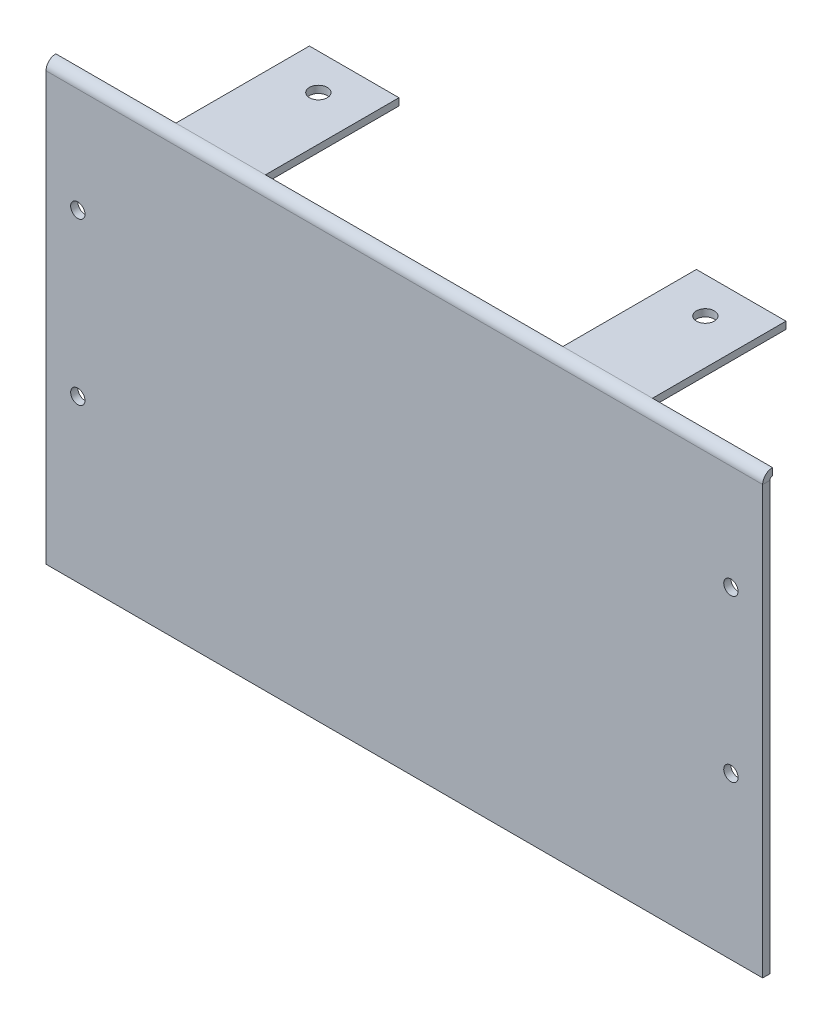
ISO-10303-21;
HEADER;
FILE_DESCRIPTION(('STEP AP214'),'2;1');
FILE_NAME('part.step','',(''),(''),'','','');
FILE_SCHEMA(('AUTOMOTIVE_DESIGN { 1 0 10303 214 1 1 1 1 }'));
ENDSEC;
DATA;
#1=APPLICATION_CONTEXT('core data for automotive mechanical design processes');
#2=APPLICATION_PROTOCOL_DEFINITION('international standard','automotive_design',2000,#1);
#3=PRODUCT_CONTEXT('',#1,'mechanical');
#4=PRODUCT('Part','Part','',(#3));
#5=PRODUCT_RELATED_PRODUCT_CATEGORY('part','',(#4));
#6=PRODUCT_DEFINITION_FORMATION('','',#4);
#7=PRODUCT_DEFINITION_CONTEXT('part definition',#1,'design');
#8=PRODUCT_DEFINITION('design','',#6,#7);
#9=PRODUCT_DEFINITION_SHAPE('','',#8);
#10=(LENGTH_UNIT() NAMED_UNIT(*) SI_UNIT(.MILLI.,.METRE.));
#11=(NAMED_UNIT(*) PLANE_ANGLE_UNIT() SI_UNIT($,.RADIAN.));
#12=(NAMED_UNIT(*) SI_UNIT($,.STERADIAN.) SOLID_ANGLE_UNIT());
#13=UNCERTAINTY_MEASURE_WITH_UNIT(LENGTH_MEASURE(1.E-05),#10,'distance_accuracy_value','');
#14=(GEOMETRIC_REPRESENTATION_CONTEXT(3) GLOBAL_UNCERTAINTY_ASSIGNED_CONTEXT((#13)) GLOBAL_UNIT_ASSIGNED_CONTEXT((#10,
#11,#12)) REPRESENTATION_CONTEXT('',''));
#15=CARTESIAN_POINT('',(0.,0.,0.));
#16=DIRECTION('',(0.,0.,1.));
#17=DIRECTION('',(1.,0.,0.));
#18=AXIS2_PLACEMENT_3D('',#15,#16,#17);
#19=CARTESIAN_POINT('',(0.,122.,4.45228893450774E-13));
#20=DIRECTION('',(0.,1.,0.));
#21=DIRECTION('',(0.,0.,1.));
#22=AXIS2_PLACEMENT_3D('',#19,#20,#21);
#23=PLANE('',#22);
#24=DIRECTION('',(0.,0.,-1.));
#25=VECTOR('',#24,1.);
#26=CARTESIAN_POINT('',(141.5,122.,-2.7366));
#27=LINE('',#26,#25);
#28=CARTESIAN_POINT('',(141.5,122.,-2.7366));
#29=VERTEX_POINT('',#28);
#30=CARTESIAN_POINT('',(141.5,122.,-40.));
#31=VERTEX_POINT('',#30);
#32=EDGE_CURVE('E279',#29,#31,#27,.T.);
#33=ORIENTED_EDGE('',*,*,#32,.F.);
#34=DIRECTION('',(1.,0.,0.));
#35=VECTOR('',#34,1.);
#36=CARTESIAN_POINT('',(0.,122.,-2.7366));
#37=LINE('',#36,#35);
#38=CARTESIAN_POINT('',(166.5,122.,-2.73659999999999));
#39=VERTEX_POINT('',#38);
#40=EDGE_CURVE('E244',#29,#39,#37,.T.);
#41=ORIENTED_EDGE('',*,*,#40,.T.);
#42=DIRECTION('',(0.,0.,1.));
#43=VECTOR('',#42,1.);
#44=CARTESIAN_POINT('',(166.5,122.,-2.73659999999999));
#45=LINE('',#44,#43);
#46=CARTESIAN_POINT('',(166.5,122.,-40.));
#47=VERTEX_POINT('',#46);
#48=EDGE_CURVE('E295',#47,#39,#45,.T.);
#49=ORIENTED_EDGE('',*,*,#48,.F.);
#50=DIRECTION('',(1.,0.,0.));
#51=VECTOR('',#50,1.);
#52=CARTESIAN_POINT('',(200.,122.,-40.));
#53=LINE('',#52,#51);
#54=EDGE_CURVE('E153',#31,#47,#53,.T.);
#55=ORIENTED_EDGE('',*,*,#54,.F.);
#56=EDGE_LOOP('',(#33,#41,#49,#55));
#57=FACE_BOUND('',#56,.T.);
#58=CARTESIAN_POINT('',(154.,122.,-30.));
#59=DIRECTION('',(0.,1.,0.));
#60=DIRECTION('',(0.,0.,1.));
#61=AXIS2_PLACEMENT_3D('',#58,#59,#60);
#62=CIRCLE('',#61,2.5);
#63=CARTESIAN_POINT('',(154.,122.,-27.5));
#64=VERTEX_POINT('',#63);
#65=EDGE_CURVE('E312',#64,#64,#62,.T.);
#66=ORIENTED_EDGE('',*,*,#65,.F.);
#67=EDGE_LOOP('',(#66));
#68=FACE_BOUND('',#67,.T.);
#69=ADVANCED_FACE('F37',(#57,#68),#23,.T.);
#70=CARTESIAN_POINT('',(0.,120.,4.38245930773088E-13));
#71=DIRECTION('',(0.,1.,0.));
#72=DIRECTION('',(0.,0.,1.));
#73=AXIS2_PLACEMENT_3D('',#70,#71,#72);
#74=PLANE('',#73);
#75=CARTESIAN_POINT('',(154.,120.,-30.));
#76=DIRECTION('',(0.,1.,0.));
#77=DIRECTION('',(0.,0.,1.));
#78=AXIS2_PLACEMENT_3D('',#75,#76,#77);
#79=CIRCLE('',#78,2.5);
#80=CARTESIAN_POINT('',(154.,120.,-27.5));
#81=VERTEX_POINT('',#80);
#82=EDGE_CURVE('E253',#81,#81,#79,.F.);
#83=ORIENTED_EDGE('',*,*,#82,.F.);
#84=EDGE_LOOP('',(#83));
#85=FACE_BOUND('',#84,.T.);
#86=DIRECTION('',(1.,0.,0.));
#87=VECTOR('',#86,1.);
#88=CARTESIAN_POINT('',(0.,120.,-2.73660000000001));
#89=LINE('',#88,#87);
#90=CARTESIAN_POINT('',(141.5,120.,-2.73660000000001));
#91=VERTEX_POINT('',#90);
#92=CARTESIAN_POINT('',(166.5,120.,-2.7366));
#93=VERTEX_POINT('',#92);
#94=EDGE_CURVE('E249',#91,#93,#89,.T.);
#95=ORIENTED_EDGE('',*,*,#94,.F.);
#96=DIRECTION('',(0.,0.,1.));
#97=VECTOR('',#96,1.);
#98=CARTESIAN_POINT('',(141.5,120.,-2.73660000000001));
#99=LINE('',#98,#97);
#100=CARTESIAN_POINT('',(141.5,120.,-40.));
#101=VERTEX_POINT('',#100);
#102=EDGE_CURVE('E328',#101,#91,#99,.T.);
#103=ORIENTED_EDGE('',*,*,#102,.F.);
#104=DIRECTION('',(1.,0.,0.));
#105=VECTOR('',#104,1.);
#106=CARTESIAN_POINT('',(200.,120.,-40.));
#107=LINE('',#106,#105);
#108=CARTESIAN_POINT('',(166.5,120.,-40.));
#109=VERTEX_POINT('',#108);
#110=EDGE_CURVE('E154',#101,#109,#107,.T.);
#111=ORIENTED_EDGE('',*,*,#110,.T.);
#112=DIRECTION('',(0.,0.,-1.));
#113=VECTOR('',#112,1.);
#114=CARTESIAN_POINT('',(166.5,120.,-2.7366));
#115=LINE('',#114,#113);
#116=EDGE_CURVE('E292',#93,#109,#115,.T.);
#117=ORIENTED_EDGE('',*,*,#116,.F.);
#118=EDGE_LOOP('',(#95,#103,#111,#117));
#119=FACE_BOUND('',#118,.T.);
#120=ADVANCED_FACE('F319',(#85,#119),#74,.F.);
#121=CARTESIAN_POINT('',(200.,122.,-40.));
#122=DIRECTION('',(0.,0.,-1.));
#123=DIRECTION('',(0.,1.,0.));
#124=AXIS2_PLACEMENT_3D('',#121,#122,#123);
#125=PLANE('',#124);
#126=DIRECTION('',(0.,1.,0.));
#127=VECTOR('',#126,1.);
#128=CARTESIAN_POINT('',(141.5,-0.000999999999987122,-40.0000000000004));
#129=LINE('',#128,#127);
#130=EDGE_CURVE('E282',#101,#31,#129,.T.);
#131=ORIENTED_EDGE('',*,*,#130,.T.);
#132=ORIENTED_EDGE('',*,*,#54,.T.);
#133=DIRECTION('',(0.,1.,0.));
#134=VECTOR('',#133,1.);
#135=CARTESIAN_POINT('',(166.5,-0.000999999999987122,-40.0000000000004));
#136=LINE('',#135,#134);
#137=EDGE_CURVE('E300',#109,#47,#136,.T.);
#138=ORIENTED_EDGE('',*,*,#137,.F.);
#139=ORIENTED_EDGE('',*,*,#110,.F.);
#140=EDGE_LOOP('',(#131,#132,#138,#139));
#141=FACE_BOUND('',#140,.T.);
#142=ADVANCED_FACE('F322',(#141),#125,.T.);
#143=CARTESIAN_POINT('',(200.,0.,-2.));
#144=DIRECTION('',(1.,0.,0.));
#145=DIRECTION('',(0.,0.,-1.));
#146=AXIS2_PLACEMENT_3D('',#143,#144,#145);
#147=PLANE('',#146);
#148=DIRECTION('',(0.,1.,0.));
#149=VECTOR('',#148,1.);
#150=CARTESIAN_POINT('',(200.,0.,-2.));
#151=LINE('',#150,#149);
#152=CARTESIAN_POINT('',(200.,0.,-2.));
#153=VERTEX_POINT('',#152);
#154=CARTESIAN_POINT('',(200.,119.2634,-2.));
#155=VERTEX_POINT('',#154);
#156=EDGE_CURVE('E214',#153,#155,#151,.T.);
#157=ORIENTED_EDGE('',*,*,#156,.T.);
#158=DIRECTION('',(0.,0.,1.));
#159=VECTOR('',#158,1.);
#160=CARTESIAN_POINT('',(200.,119.2634,-2.));
#161=LINE('',#160,#159);
#162=CARTESIAN_POINT('',(200.,119.2634,0.));
#163=VERTEX_POINT('',#162);
#164=EDGE_CURVE('E167',#155,#163,#161,.T.);
#165=ORIENTED_EDGE('',*,*,#164,.T.);
#166=DIRECTION('',(0.,1.,0.));
#167=VECTOR('',#166,1.);
#168=CARTESIAN_POINT('',(200.,0.,0.));
#169=LINE('',#168,#167);
#170=CARTESIAN_POINT('',(200.,0.,0.));
#171=VERTEX_POINT('',#170);
#172=EDGE_CURVE('E211',#171,#163,#169,.T.);
#173=ORIENTED_EDGE('',*,*,#172,.F.);
#174=DIRECTION('',(0.,0.,1.));
#175=VECTOR('',#174,1.);
#176=CARTESIAN_POINT('',(200.,0.,-2.));
#177=LINE('',#176,#175);
#178=EDGE_CURVE('E11',#153,#171,#177,.T.);
#179=ORIENTED_EDGE('',*,*,#178,.F.);
#180=EDGE_LOOP('',(#157,#165,#173,#179));
#181=FACE_BOUND('',#180,.T.);
#182=ADVANCED_FACE('F405',(#181),#147,.T.);
#183=CARTESIAN_POINT('',(0.,0.,-2.));
#184=DIRECTION('',(0.,0.,-1.));
#185=DIRECTION('',(-1.,0.,0.));
#186=AXIS2_PLACEMENT_3D('',#183,#184,#185);
#187=PLANE('',#186);
#188=CARTESIAN_POINT('',(8.86999999999999,90.,-2.));
#189=DIRECTION('',(0.,0.,-1.));
#190=DIRECTION('',(-1.,0.,0.));
#191=AXIS2_PLACEMENT_3D('',#188,#189,#190);
#192=CIRCLE('',#191,2.);
#193=CARTESIAN_POINT('',(6.86999999999999,90.,-2.));
#194=VERTEX_POINT('',#193);
#195=EDGE_CURVE('E199',#194,#194,#192,.F.);
#196=ORIENTED_EDGE('',*,*,#195,.T.);
#197=EDGE_LOOP('',(#196));
#198=FACE_BOUND('',#197,.T.);
#199=CARTESIAN_POINT('',(8.86999999999999,45.,-2.));
#200=DIRECTION('',(0.,0.,-1.));
#201=DIRECTION('',(-1.,0.,0.));
#202=AXIS2_PLACEMENT_3D('',#199,#200,#201);
#203=CIRCLE('',#202,2.);
#204=CARTESIAN_POINT('',(6.86999999999999,45.,-2.));
#205=VERTEX_POINT('',#204);
#206=EDGE_CURVE('E193',#205,#205,#203,.F.);
#207=ORIENTED_EDGE('',*,*,#206,.T.);
#208=EDGE_LOOP('',(#207));
#209=FACE_BOUND('',#208,.T.);
#210=CARTESIAN_POINT('',(191.13,45.,-2.));
#211=DIRECTION('',(0.,0.,-1.));
#212=DIRECTION('',(-1.,0.,0.));
#213=AXIS2_PLACEMENT_3D('',#210,#211,#212);
#214=CIRCLE('',#213,2.);
#215=CARTESIAN_POINT('',(189.13,45.,-2.));
#216=VERTEX_POINT('',#215);
#217=EDGE_CURVE('E187',#216,#216,#214,.F.);
#218=ORIENTED_EDGE('',*,*,#217,.T.);
#219=EDGE_LOOP('',(#218));
#220=FACE_BOUND('',#219,.T.);
#221=CARTESIAN_POINT('',(191.13,90.,-2.));
#222=DIRECTION('',(0.,0.,-1.));
#223=DIRECTION('',(-1.,0.,0.));
#224=AXIS2_PLACEMENT_3D('',#221,#222,#223);
#225=CIRCLE('',#224,2.);
#226=CARTESIAN_POINT('',(189.13,90.,-2.));
#227=VERTEX_POINT('',#226);
#228=EDGE_CURVE('E182',#227,#227,#225,.F.);
#229=ORIENTED_EDGE('',*,*,#228,.T.);
#230=EDGE_LOOP('',(#229));
#231=FACE_BOUND('',#230,.T.);
#232=DIRECTION('',(0.,-1.,0.));
#233=VECTOR('',#232,1.);
#234=CARTESIAN_POINT('',(0.,0.,-2.));
#235=LINE('',#234,#233);
#236=CARTESIAN_POINT('',(0.,119.2634,-2.));
#237=VERTEX_POINT('',#236);
#238=CARTESIAN_POINT('',(0.,0.,-2.));
#239=VERTEX_POINT('',#238);
#240=EDGE_CURVE('E208',#237,#239,#235,.T.);
#241=ORIENTED_EDGE('',*,*,#240,.F.);
#242=DIRECTION('',(1.,0.,0.));
#243=VECTOR('',#242,1.);
#244=CARTESIAN_POINT('',(200.,119.2634,-2.));
#245=LINE('',#244,#243);
#246=EDGE_CURVE('E173',#155,#237,#245,.F.);
#247=ORIENTED_EDGE('',*,*,#246,.F.);
#248=ORIENTED_EDGE('',*,*,#156,.F.);
#249=DIRECTION('',(1.,0.,0.));
#250=VECTOR('',#249,1.);
#251=CARTESIAN_POINT('',(0.,0.,-2.));
#252=LINE('',#251,#250);
#253=EDGE_CURVE('E210',#239,#153,#252,.T.);
#254=ORIENTED_EDGE('',*,*,#253,.F.);
#255=EDGE_LOOP('',(#241,#247,#248,#254));
#256=FACE_BOUND('',#255,.T.);
#257=ADVANCED_FACE('F402',(#198,#209,#220,#231,#256),#187,.T.);
#258=CARTESIAN_POINT('',(0.,0.,0.));
#259=DIRECTION('',(0.,0.,-1.));
#260=DIRECTION('',(-1.,0.,0.));
#261=AXIS2_PLACEMENT_3D('',#258,#259,#260);
#262=PLANE('',#261);
#263=CARTESIAN_POINT('',(8.86999999999999,90.,0.));
#264=DIRECTION('',(0.,0.,1.));
#265=DIRECTION('',(1.,0.,0.));
#266=AXIS2_PLACEMENT_3D('',#263,#264,#265);
#267=CIRCLE('',#266,2.);
#268=CARTESIAN_POINT('',(10.87,90.,0.));
#269=VERTEX_POINT('',#268);
#270=EDGE_CURVE('E202',#269,#269,#267,.T.);
#271=ORIENTED_EDGE('',*,*,#270,.F.);
#272=EDGE_LOOP('',(#271));
#273=FACE_BOUND('',#272,.T.);
#274=CARTESIAN_POINT('',(8.86999999999999,45.,0.));
#275=DIRECTION('',(0.,0.,1.));
#276=DIRECTION('',(1.,0.,0.));
#277=AXIS2_PLACEMENT_3D('',#274,#275,#276);
#278=CIRCLE('',#277,2.);
#279=CARTESIAN_POINT('',(10.87,45.,0.));
#280=VERTEX_POINT('',#279);
#281=EDGE_CURVE('E196',#280,#280,#278,.T.);
#282=ORIENTED_EDGE('',*,*,#281,.F.);
#283=EDGE_LOOP('',(#282));
#284=FACE_BOUND('',#283,.T.);
#285=CARTESIAN_POINT('',(191.13,45.,0.));
#286=DIRECTION('',(0.,0.,1.));
#287=DIRECTION('',(1.,0.,0.));
#288=AXIS2_PLACEMENT_3D('',#285,#286,#287);
#289=CIRCLE('',#288,2.);
#290=CARTESIAN_POINT('',(193.13,45.,0.));
#291=VERTEX_POINT('',#290);
#292=EDGE_CURVE('E190',#291,#291,#289,.T.);
#293=ORIENTED_EDGE('',*,*,#292,.F.);
#294=EDGE_LOOP('',(#293));
#295=FACE_BOUND('',#294,.T.);
#296=CARTESIAN_POINT('',(191.13,90.,0.));
#297=DIRECTION('',(0.,0.,1.));
#298=DIRECTION('',(1.,0.,0.));
#299=AXIS2_PLACEMENT_3D('',#296,#297,#298);
#300=CIRCLE('',#299,2.);
#301=CARTESIAN_POINT('',(193.13,90.,0.));
#302=VERTEX_POINT('',#301);
#303=EDGE_CURVE('E184',#302,#302,#300,.T.);
#304=ORIENTED_EDGE('',*,*,#303,.F.);
#305=EDGE_LOOP('',(#304));
#306=FACE_BOUND('',#305,.T.);
#307=DIRECTION('',(1.,0.,0.));
#308=VECTOR('',#307,1.);
#309=CARTESIAN_POINT('',(200.,119.2634,0.));
#310=LINE('',#309,#308);
#311=CARTESIAN_POINT('',(0.,119.2634,0.));
#312=VERTEX_POINT('',#311);
#313=EDGE_CURVE('E161',#163,#312,#310,.F.);
#314=ORIENTED_EDGE('',*,*,#313,.T.);
#315=DIRECTION('',(0.,-1.,0.));
#316=VECTOR('',#315,1.);
#317=CARTESIAN_POINT('',(0.,0.,0.));
#318=LINE('',#317,#316);
#319=CARTESIAN_POINT('',(0.,0.,0.));
#320=VERTEX_POINT('',#319);
#321=EDGE_CURVE('E205',#312,#320,#318,.T.);
#322=ORIENTED_EDGE('',*,*,#321,.T.);
#323=DIRECTION('',(1.,0.,0.));
#324=VECTOR('',#323,1.);
#325=CARTESIAN_POINT('',(0.,0.,0.));
#326=LINE('',#325,#324);
#327=EDGE_CURVE('E218',#320,#171,#326,.T.);
#328=ORIENTED_EDGE('',*,*,#327,.T.);
#329=ORIENTED_EDGE('',*,*,#172,.T.);
#330=EDGE_LOOP('',(#314,#322,#328,#329));
#331=FACE_BOUND('',#330,.T.);
#332=ADVANCED_FACE('F225',(#273,#284,#295,#306,#331),#262,.F.);
#333=CARTESIAN_POINT('',(0.,0.,-2.));
#334=DIRECTION('',(-1.,0.,0.));
#335=DIRECTION('',(0.,0.,1.));
#336=AXIS2_PLACEMENT_3D('',#333,#334,#335);
#337=PLANE('',#336);
#338=DIRECTION('',(0.,0.,1.));
#339=VECTOR('',#338,1.);
#340=CARTESIAN_POINT('',(0.,119.2634,-2.));
#341=LINE('',#340,#339);
#342=EDGE_CURVE('E179',#237,#312,#341,.T.);
#343=ORIENTED_EDGE('',*,*,#342,.F.);
#344=ORIENTED_EDGE('',*,*,#240,.T.);
#345=DIRECTION('',(0.,0.,1.));
#346=VECTOR('',#345,1.);
#347=CARTESIAN_POINT('',(0.,0.,-2.));
#348=LINE('',#347,#346);
#349=EDGE_CURVE('E41',#239,#320,#348,.T.);
#350=ORIENTED_EDGE('',*,*,#349,.T.);
#351=ORIENTED_EDGE('',*,*,#321,.F.);
#352=EDGE_LOOP('',(#343,#344,#350,#351));
#353=FACE_BOUND('',#352,.T.);
#354=ADVANCED_FACE('F39',(#353),#337,.T.);
#355=CARTESIAN_POINT('',(0.,0.,-2.));
#356=DIRECTION('',(0.,-1.,0.));
#357=DIRECTION('',(0.,0.,-1.));
#358=AXIS2_PLACEMENT_3D('',#355,#356,#357);
#359=PLANE('',#358);
#360=ORIENTED_EDGE('',*,*,#327,.F.);
#361=ORIENTED_EDGE('',*,*,#349,.F.);
#362=ORIENTED_EDGE('',*,*,#253,.T.);
#363=ORIENTED_EDGE('',*,*,#178,.T.);
#364=EDGE_LOOP('',(#360,#361,#362,#363));
#365=FACE_BOUND('',#364,.T.);
#366=ADVANCED_FACE('F400',(#365),#359,.T.);
#367=CARTESIAN_POINT('',(8.86999999999999,90.,-2.001));
#368=DIRECTION('',(0.,0.,1.));
#369=DIRECTION('',(1.,0.,0.));
#370=AXIS2_PLACEMENT_3D('',#367,#368,#369);
#371=CYLINDRICAL_SURFACE('',#370,2.);
#372=ORIENTED_EDGE('',*,*,#195,.F.);
#373=EDGE_LOOP('',(#372));
#374=FACE_BOUND('',#373,.T.);
#375=ORIENTED_EDGE('',*,*,#270,.T.);
#376=EDGE_LOOP('',(#375));
#377=FACE_BOUND('',#376,.T.);
#378=ADVANCED_FACE('F396',(#374,#377),#371,.F.);
#379=CARTESIAN_POINT('',(8.86999999999999,45.,-2.001));
#380=DIRECTION('',(0.,0.,1.));
#381=DIRECTION('',(1.,0.,0.));
#382=AXIS2_PLACEMENT_3D('',#379,#380,#381);
#383=CYLINDRICAL_SURFACE('',#382,2.);
#384=ORIENTED_EDGE('',*,*,#206,.F.);
#385=EDGE_LOOP('',(#384));
#386=FACE_BOUND('',#385,.T.);
#387=ORIENTED_EDGE('',*,*,#281,.T.);
#388=EDGE_LOOP('',(#387));
#389=FACE_BOUND('',#388,.T.);
#390=ADVANCED_FACE('F392',(#386,#389),#383,.F.);
#391=CARTESIAN_POINT('',(191.13,45.,-2.001));
#392=DIRECTION('',(0.,0.,1.));
#393=DIRECTION('',(1.,0.,0.));
#394=AXIS2_PLACEMENT_3D('',#391,#392,#393);
#395=CYLINDRICAL_SURFACE('',#394,2.);
#396=ORIENTED_EDGE('',*,*,#217,.F.);
#397=EDGE_LOOP('',(#396));
#398=FACE_BOUND('',#397,.T.);
#399=ORIENTED_EDGE('',*,*,#292,.T.);
#400=EDGE_LOOP('',(#399));
#401=FACE_BOUND('',#400,.T.);
#402=ADVANCED_FACE('F388',(#398,#401),#395,.F.);
#403=CARTESIAN_POINT('',(191.13,90.,-2.001));
#404=DIRECTION('',(0.,0.,1.));
#405=DIRECTION('',(1.,0.,0.));
#406=AXIS2_PLACEMENT_3D('',#403,#404,#405);
#407=CYLINDRICAL_SURFACE('',#406,2.);
#408=ORIENTED_EDGE('',*,*,#228,.F.);
#409=EDGE_LOOP('',(#408));
#410=FACE_BOUND('',#409,.T.);
#411=ORIENTED_EDGE('',*,*,#303,.T.);
#412=EDGE_LOOP('',(#411));
#413=FACE_BOUND('',#412,.T.);
#414=ADVANCED_FACE('F383',(#410,#413),#407,.F.);
#415=CARTESIAN_POINT('',(0.,119.2634,-2.73660000000001));
#416=DIRECTION('',(-1.,0.,0.));
#417=DIRECTION('',(0.,0.,1.));
#418=AXIS2_PLACEMENT_3D('',#415,#416,#417);
#419=PLANE('',#418);
#420=DIRECTION('',(0.,1.,0.));
#421=VECTOR('',#420,1.);
#422=CARTESIAN_POINT('',(0.,120.,-2.73660000000001));
#423=LINE('',#422,#421);
#424=CARTESIAN_POINT('',(0.,120.,-2.73660000000001));
#425=VERTEX_POINT('',#424);
#426=CARTESIAN_POINT('',(0.,122.,-2.7366));
#427=VERTEX_POINT('',#426);
#428=EDGE_CURVE('E252',#425,#427,#423,.T.);
#429=ORIENTED_EDGE('',*,*,#428,.F.);
#430=CARTESIAN_POINT('',(0.,119.2634,-2.73660000000001));
#431=DIRECTION('',(1.,0.,0.));
#432=DIRECTION('',(0.,0.,-1.));
#433=AXIS2_PLACEMENT_3D('',#430,#431,#432);
#434=CIRCLE('',#433,0.736600000000004);
#435=EDGE_CURVE('E170',#237,#425,#434,.F.);
#436=ORIENTED_EDGE('',*,*,#435,.F.);
#437=ORIENTED_EDGE('',*,*,#342,.T.);
#438=CARTESIAN_POINT('',(0.,119.2634,-2.73660000000001));
#439=DIRECTION('',(1.,0.,0.));
#440=DIRECTION('',(0.,0.,-1.));
#441=AXIS2_PLACEMENT_3D('',#438,#439,#440);
#442=CIRCLE('',#441,2.7366);
#443=EDGE_CURVE('E163',#312,#427,#442,.F.);
#444=ORIENTED_EDGE('',*,*,#443,.T.);
#445=EDGE_LOOP('',(#429,#436,#437,#444));
#446=FACE_BOUND('',#445,.T.);
#447=ADVANCED_FACE('F355',(#446),#419,.T.);
#448=CARTESIAN_POINT('',(200.,119.2634,-2.73660000000001));
#449=DIRECTION('',(-1.,0.,0.));
#450=DIRECTION('',(0.,0.,1.));
#451=AXIS2_PLACEMENT_3D('',#448,#449,#450);
#452=PLANE('',#451);
#453=CARTESIAN_POINT('',(200.,119.2634,-2.73660000000001));
#454=DIRECTION('',(1.,0.,0.));
#455=DIRECTION('',(0.,0.,-1.));
#456=AXIS2_PLACEMENT_3D('',#453,#454,#455);
#457=CIRCLE('',#456,0.736600000000004);
#458=CARTESIAN_POINT('',(200.,120.,-2.73660000000001));
#459=VERTEX_POINT('',#458);
#460=EDGE_CURVE('E176',#459,#155,#457,.T.);
#461=ORIENTED_EDGE('',*,*,#460,.F.);
#462=DIRECTION('',(0.,1.,0.));
#463=VECTOR('',#462,1.);
#464=CARTESIAN_POINT('',(200.,120.,-2.73660000000001));
#465=LINE('',#464,#463);
#466=CARTESIAN_POINT('',(200.,122.,-2.7366));
#467=VERTEX_POINT('',#466);
#468=EDGE_CURVE('E240',#459,#467,#465,.T.);
#469=ORIENTED_EDGE('',*,*,#468,.T.);
#470=CARTESIAN_POINT('',(200.,119.2634,-2.73660000000001));
#471=DIRECTION('',(1.,0.,0.));
#472=DIRECTION('',(0.,0.,-1.));
#473=AXIS2_PLACEMENT_3D('',#470,#471,#472);
#474=CIRCLE('',#473,2.7366);
#475=EDGE_CURVE('E164',#467,#163,#474,.T.);
#476=ORIENTED_EDGE('',*,*,#475,.T.);
#477=ORIENTED_EDGE('',*,*,#164,.F.);
#478=EDGE_LOOP('',(#461,#469,#476,#477));
#479=FACE_BOUND('',#478,.T.);
#480=ADVANCED_FACE('F239',(#479),#452,.F.);
#481=CARTESIAN_POINT('',(200.,119.2634,-2.73660000000001));
#482=DIRECTION('',(1.,0.,0.));
#483=DIRECTION('',(0.,1.,0.));
#484=AXIS2_PLACEMENT_3D('',#481,#482,#483);
#485=CYLINDRICAL_SURFACE('',#484,2.7366);
#486=ORIENTED_EDGE('',*,*,#313,.F.);
#487=ORIENTED_EDGE('',*,*,#475,.F.);
#488=DIRECTION('',(1.,0.,0.));
#489=VECTOR('',#488,1.);
#490=CARTESIAN_POINT('',(200.,122.,-2.7366));
#491=LINE('',#490,#489);
#492=EDGE_CURVE('E298',#39,#467,#491,.T.);
#493=ORIENTED_EDGE('',*,*,#492,.F.);
#494=ORIENTED_EDGE('',*,*,#40,.F.);
#495=DIRECTION('',(1.,0.,0.));
#496=VECTOR('',#495,1.);
#497=CARTESIAN_POINT('',(141.5,122.,-2.7366));
#498=LINE('',#497,#496);
#499=CARTESIAN_POINT('',(58.5,122.,-2.7366));
#500=VERTEX_POINT('',#499);
#501=EDGE_CURVE('E271',#500,#29,#498,.T.);
#502=ORIENTED_EDGE('',*,*,#501,.F.);
#503=CARTESIAN_POINT('',(33.5,122.,-2.7366));
#504=VERTEX_POINT('',#503);
#505=EDGE_CURVE('E247',#504,#500,#37,.T.);
#506=ORIENTED_EDGE('',*,*,#505,.F.);
#507=EDGE_CURVE('E158',#427,#504,#37,.T.);
#508=ORIENTED_EDGE('',*,*,#507,.F.);
#509=ORIENTED_EDGE('',*,*,#443,.F.);
#510=EDGE_LOOP('',(#486,#487,#493,#494,#502,#506,#508,#509));
#511=FACE_BOUND('',#510,.T.);
#512=ADVANCED_FACE('F232',(#511),#485,.T.);
#513=CARTESIAN_POINT('',(200.,119.2634,-2.73660000000001));
#514=DIRECTION('',(1.,0.,0.));
#515=DIRECTION('',(0.,1.,0.));
#516=AXIS2_PLACEMENT_3D('',#513,#514,#515);
#517=CYLINDRICAL_SURFACE('',#516,0.736600000000004);
#518=ORIENTED_EDGE('',*,*,#246,.T.);
#519=ORIENTED_EDGE('',*,*,#435,.T.);
#520=CARTESIAN_POINT('',(33.5,120.,-2.73660000000001));
#521=VERTEX_POINT('',#520);
#522=EDGE_CURVE('E245',#425,#521,#89,.T.);
#523=ORIENTED_EDGE('',*,*,#522,.T.);
#524=CARTESIAN_POINT('',(58.5,120.,-2.73660000000001));
#525=VERTEX_POINT('',#524);
#526=EDGE_CURVE('E146',#521,#525,#89,.T.);
#527=ORIENTED_EDGE('',*,*,#526,.T.);
#528=DIRECTION('',(1.,0.,0.));
#529=VECTOR('',#528,1.);
#530=CARTESIAN_POINT('',(0.,120.,-2.73660000000001));
#531=LINE('',#530,#529);
#532=EDGE_CURVE('E274',#525,#91,#531,.T.);
#533=ORIENTED_EDGE('',*,*,#532,.T.);
#534=ORIENTED_EDGE('',*,*,#94,.T.);
#535=DIRECTION('',(1.,0.,0.));
#536=VECTOR('',#535,1.);
#537=CARTESIAN_POINT('',(0.,120.,-2.73660000000001));
#538=LINE('',#537,#536);
#539=EDGE_CURVE('E288',#93,#459,#538,.T.);
#540=ORIENTED_EDGE('',*,*,#539,.T.);
#541=ORIENTED_EDGE('',*,*,#460,.T.);
#542=EDGE_LOOP('',(#518,#519,#523,#527,#533,#534,#540,#541));
#543=FACE_BOUND('',#542,.T.);
#544=ADVANCED_FACE('F332',(#543),#517,.F.);
#545=DIRECTION('',(0.,0.,-1.));
#546=VECTOR('',#545,1.);
#547=CARTESIAN_POINT('',(33.5,122.,-2.7366));
#548=LINE('',#547,#546);
#549=CARTESIAN_POINT('',(33.5,122.,-40.));
#550=VERTEX_POINT('',#549);
#551=EDGE_CURVE('E52',#504,#550,#548,.T.);
#552=ORIENTED_EDGE('',*,*,#551,.F.);
#553=ORIENTED_EDGE('',*,*,#505,.T.);
#554=DIRECTION('',(0.,0.,1.));
#555=VECTOR('',#554,1.);
#556=CARTESIAN_POINT('',(58.5,122.,-2.7366));
#557=LINE('',#556,#555);
#558=CARTESIAN_POINT('',(58.5,122.,-40.));
#559=VERTEX_POINT('',#558);
#560=EDGE_CURVE('E263',#559,#500,#557,.T.);
#561=ORIENTED_EDGE('',*,*,#560,.F.);
#562=EDGE_CURVE('E156',#550,#559,#53,.T.);
#563=ORIENTED_EDGE('',*,*,#562,.F.);
#564=EDGE_LOOP('',(#552,#553,#561,#563));
#565=FACE_BOUND('',#564,.T.);
#566=CARTESIAN_POINT('',(46.,122.,-30.));
#567=DIRECTION('',(0.,1.,0.));
#568=DIRECTION('',(0.,0.,1.));
#569=AXIS2_PLACEMENT_3D('',#566,#567,#568);
#570=CIRCLE('',#569,2.5);
#571=CARTESIAN_POINT('',(46.,122.,-27.5));
#572=VERTEX_POINT('',#571);
#573=EDGE_CURVE('E304',#572,#572,#570,.T.);
#574=ORIENTED_EDGE('',*,*,#573,.F.);
#575=EDGE_LOOP('',(#574));
#576=FACE_BOUND('',#575,.T.);
#577=ADVANCED_FACE('F260',(#565,#576),#23,.T.);
#578=CARTESIAN_POINT('',(46.,120.,-30.));
#579=DIRECTION('',(0.,1.,0.));
#580=DIRECTION('',(0.,0.,1.));
#581=AXIS2_PLACEMENT_3D('',#578,#579,#580);
#582=CIRCLE('',#581,2.5);
#583=CARTESIAN_POINT('',(46.,120.,-27.5));
#584=VERTEX_POINT('',#583);
#585=EDGE_CURVE('E309',#584,#584,#582,.F.);
#586=ORIENTED_EDGE('',*,*,#585,.F.);
#587=EDGE_LOOP('',(#586));
#588=FACE_BOUND('',#587,.T.);
#589=ORIENTED_EDGE('',*,*,#526,.F.);
#590=DIRECTION('',(0.,0.,1.));
#591=VECTOR('',#590,1.);
#592=CARTESIAN_POINT('',(33.5,120.,-2.73660000000001));
#593=LINE('',#592,#591);
#594=CARTESIAN_POINT('',(33.5,120.,-40.));
#595=VERTEX_POINT('',#594);
#596=EDGE_CURVE('E139',#595,#521,#593,.T.);
#597=ORIENTED_EDGE('',*,*,#596,.F.);
#598=CARTESIAN_POINT('',(58.5,120.,-40.));
#599=VERTEX_POINT('',#598);
#600=EDGE_CURVE('E60',#595,#599,#107,.T.);
#601=ORIENTED_EDGE('',*,*,#600,.T.);
#602=DIRECTION('',(0.,0.,-1.));
#603=VECTOR('',#602,1.);
#604=CARTESIAN_POINT('',(58.5,120.,-2.73660000000001));
#605=LINE('',#604,#603);
#606=EDGE_CURVE('E333',#525,#599,#605,.T.);
#607=ORIENTED_EDGE('',*,*,#606,.F.);
#608=EDGE_LOOP('',(#589,#597,#601,#607));
#609=FACE_BOUND('',#608,.T.);
#610=ADVANCED_FACE('F145',(#588,#609),#74,.F.);
#611=DIRECTION('',(0.,1.,0.));
#612=VECTOR('',#611,1.);
#613=CARTESIAN_POINT('',(33.5,-0.000999999999987122,-40.0000000000004));
#614=LINE('',#613,#612);
#615=EDGE_CURVE('E137',#595,#550,#614,.T.);
#616=ORIENTED_EDGE('',*,*,#615,.T.);
#617=ORIENTED_EDGE('',*,*,#562,.T.);
#618=DIRECTION('',(0.,1.,0.));
#619=VECTOR('',#618,1.);
#620=CARTESIAN_POINT('',(58.5,-0.000999999999987122,-40.0000000000004));
#621=LINE('',#620,#619);
#622=EDGE_CURVE('E152',#599,#559,#621,.T.);
#623=ORIENTED_EDGE('',*,*,#622,.F.);
#624=ORIENTED_EDGE('',*,*,#600,.F.);
#625=EDGE_LOOP('',(#616,#617,#623,#624));
#626=FACE_BOUND('',#625,.T.);
#627=ADVANCED_FACE('F150',(#626),#125,.T.);
#628=CARTESIAN_POINT('',(154.,-0.00100000000002876,-30.0000000000004));
#629=DIRECTION('',(0.,1.,0.));
#630=DIRECTION('',(0.,0.,1.));
#631=AXIS2_PLACEMENT_3D('',#628,#629,#630);
#632=CYLINDRICAL_SURFACE('',#631,2.5);
#633=ORIENTED_EDGE('',*,*,#65,.T.);
#634=EDGE_LOOP('',(#633));
#635=FACE_BOUND('',#634,.T.);
#636=ORIENTED_EDGE('',*,*,#82,.T.);
#637=EDGE_LOOP('',(#636));
#638=FACE_BOUND('',#637,.T.);
#639=ADVANCED_FACE('F317',(#635,#638),#632,.F.);
#640=CARTESIAN_POINT('',(46.,-0.00100000000002876,-30.0000000000004));
#641=DIRECTION('',(0.,1.,0.));
#642=DIRECTION('',(0.,0.,1.));
#643=AXIS2_PLACEMENT_3D('',#640,#641,#642);
#644=CYLINDRICAL_SURFACE('',#643,2.5);
#645=ORIENTED_EDGE('',*,*,#573,.T.);
#646=EDGE_LOOP('',(#645));
#647=FACE_BOUND('',#646,.T.);
#648=ORIENTED_EDGE('',*,*,#585,.T.);
#649=EDGE_LOOP('',(#648));
#650=FACE_BOUND('',#649,.T.);
#651=ADVANCED_FACE('F460',(#647,#650),#644,.F.);
#652=CARTESIAN_POINT('',(200.,-0.0010000000001259,-2.73660000000044));
#653=DIRECTION('',(0.,0.,1.));
#654=DIRECTION('',(0.,-1.,0.));
#655=AXIS2_PLACEMENT_3D('',#652,#653,#654);
#656=PLANE('',#655);
#657=ORIENTED_EDGE('',*,*,#539,.F.);
#658=DIRECTION('',(0.,1.,0.));
#659=VECTOR('',#658,1.);
#660=CARTESIAN_POINT('',(166.5,-0.0010000000001259,-2.73660000000044));
#661=LINE('',#660,#659);
#662=EDGE_CURVE('E301',#93,#39,#661,.T.);
#663=ORIENTED_EDGE('',*,*,#662,.T.);
#664=ORIENTED_EDGE('',*,*,#492,.T.);
#665=ORIENTED_EDGE('',*,*,#468,.F.);
#666=EDGE_LOOP('',(#657,#663,#664,#665));
#667=FACE_BOUND('',#666,.T.);
#668=ADVANCED_FACE('F348',(#667),#656,.F.);
#669=CARTESIAN_POINT('',(166.5,-0.0010000000001259,-2.73660000000044));
#670=DIRECTION('',(-1.,0.,0.));
#671=DIRECTION('',(0.,0.,1.));
#672=AXIS2_PLACEMENT_3D('',#669,#670,#671);
#673=PLANE('',#672);
#674=ORIENTED_EDGE('',*,*,#116,.T.);
#675=ORIENTED_EDGE('',*,*,#137,.T.);
#676=ORIENTED_EDGE('',*,*,#48,.T.);
#677=ORIENTED_EDGE('',*,*,#662,.F.);
#678=EDGE_LOOP('',(#674,#675,#676,#677));
#679=FACE_BOUND('',#678,.T.);
#680=ADVANCED_FACE('F347',(#679),#673,.F.);
#681=CARTESIAN_POINT('',(141.5,-0.0010000000001259,-2.73660000000044));
#682=DIRECTION('',(1.,0.,0.));
#683=DIRECTION('',(0.,0.,-1.));
#684=AXIS2_PLACEMENT_3D('',#681,#682,#683);
#685=PLANE('',#684);
#686=ORIENTED_EDGE('',*,*,#102,.T.);
#687=DIRECTION('',(0.,1.,0.));
#688=VECTOR('',#687,1.);
#689=CARTESIAN_POINT('',(141.5,-0.0010000000001259,-2.73660000000044));
#690=LINE('',#689,#688);
#691=EDGE_CURVE('E276',#91,#29,#690,.T.);
#692=ORIENTED_EDGE('',*,*,#691,.T.);
#693=ORIENTED_EDGE('',*,*,#32,.T.);
#694=ORIENTED_EDGE('',*,*,#130,.F.);
#695=EDGE_LOOP('',(#686,#692,#693,#694));
#696=FACE_BOUND('',#695,.T.);
#697=ADVANCED_FACE('F339',(#696),#685,.F.);
#698=CARTESIAN_POINT('',(141.5,-0.0010000000001259,-2.73660000000044));
#699=DIRECTION('',(0.,0.,1.));
#700=DIRECTION('',(0.,-1.,0.));
#701=AXIS2_PLACEMENT_3D('',#698,#699,#700);
#702=PLANE('',#701);
#703=ORIENTED_EDGE('',*,*,#532,.F.);
#704=DIRECTION('',(0.,1.,0.));
#705=VECTOR('',#704,1.);
#706=CARTESIAN_POINT('',(58.5,-0.0010000000001259,-2.73660000000044));
#707=LINE('',#706,#705);
#708=EDGE_CURVE('E269',#525,#500,#707,.T.);
#709=ORIENTED_EDGE('',*,*,#708,.T.);
#710=ORIENTED_EDGE('',*,*,#501,.T.);
#711=ORIENTED_EDGE('',*,*,#691,.F.);
#712=EDGE_LOOP('',(#703,#709,#710,#711));
#713=FACE_BOUND('',#712,.T.);
#714=ADVANCED_FACE('F270',(#713),#702,.F.);
#715=CARTESIAN_POINT('',(58.5,-0.0010000000001259,-2.73660000000044));
#716=DIRECTION('',(-1.,0.,0.));
#717=DIRECTION('',(0.,0.,1.));
#718=AXIS2_PLACEMENT_3D('',#715,#716,#717);
#719=PLANE('',#718);
#720=ORIENTED_EDGE('',*,*,#606,.T.);
#721=ORIENTED_EDGE('',*,*,#622,.T.);
#722=ORIENTED_EDGE('',*,*,#560,.T.);
#723=ORIENTED_EDGE('',*,*,#708,.F.);
#724=EDGE_LOOP('',(#720,#721,#722,#723));
#725=FACE_BOUND('',#724,.T.);
#726=ADVANCED_FACE('F278',(#725),#719,.F.);
#727=CARTESIAN_POINT('',(33.5,-0.0010000000001259,-2.73660000000044));
#728=DIRECTION('',(1.,0.,0.));
#729=DIRECTION('',(0.,0.,-1.));
#730=AXIS2_PLACEMENT_3D('',#727,#728,#729);
#731=PLANE('',#730);
#732=ORIENTED_EDGE('',*,*,#596,.T.);
#733=DIRECTION('',(0.,1.,0.));
#734=VECTOR('',#733,1.);
#735=CARTESIAN_POINT('',(33.5,-0.0010000000001259,-2.73660000000044));
#736=LINE('',#735,#734);
#737=EDGE_CURVE('E143',#521,#504,#736,.T.);
#738=ORIENTED_EDGE('',*,*,#737,.T.);
#739=ORIENTED_EDGE('',*,*,#551,.T.);
#740=ORIENTED_EDGE('',*,*,#615,.F.);
#741=EDGE_LOOP('',(#732,#738,#739,#740));
#742=FACE_BOUND('',#741,.T.);
#743=ADVANCED_FACE('F138',(#742),#731,.F.);
#744=CARTESIAN_POINT('',(33.5,-0.0010000000001259,-2.73660000000044));
#745=DIRECTION('',(0.,0.,1.));
#746=DIRECTION('',(0.,-1.,0.));
#747=AXIS2_PLACEMENT_3D('',#744,#745,#746);
#748=PLANE('',#747);
#749=ORIENTED_EDGE('',*,*,#522,.F.);
#750=ORIENTED_EDGE('',*,*,#428,.T.);
#751=ORIENTED_EDGE('',*,*,#507,.T.);
#752=ORIENTED_EDGE('',*,*,#737,.F.);
#753=EDGE_LOOP('',(#749,#750,#751,#752));
#754=FACE_BOUND('',#753,.T.);
#755=ADVANCED_FACE('F356',(#754),#748,.F.);
#756=CLOSED_SHELL('',(#69,#120,#142,#182,#257,#332,#354,#366,#378,#390,#402,#414,#447,#480,#512,
#544,#577,#610,#627,#639,#651,#668,#680,#697,#714,#726,#743,#755));
#757=MANIFOLD_SOLID_BREP('B2',#756);
#758=ADVANCED_BREP_SHAPE_REPRESENTATION('',(#18,#757),#14);
#759=SHAPE_DEFINITION_REPRESENTATION(#9,#758);
ENDSEC;
END-ISO-10303-21;
